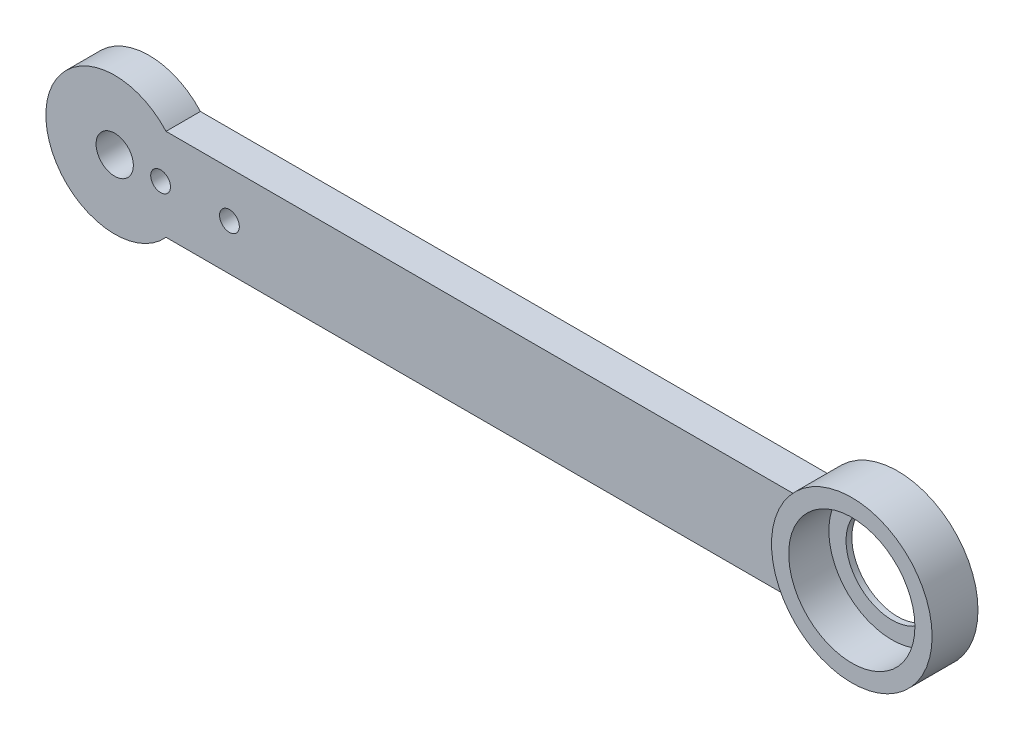
ISO-10303-21;
HEADER;
FILE_DESCRIPTION(('STEP AP214'),'2;1');
FILE_NAME('part.step','',(''),(''),'','','');
FILE_SCHEMA(('AUTOMOTIVE_DESIGN { 1 0 10303 214 1 1 1 1 }'));
ENDSEC;
DATA;
#1=APPLICATION_CONTEXT('core data for automotive mechanical design processes');
#2=APPLICATION_PROTOCOL_DEFINITION('international standard','automotive_design',2000,#1);
#3=PRODUCT_CONTEXT('',#1,'mechanical');
#4=PRODUCT('Part','Part','',(#3));
#5=PRODUCT_RELATED_PRODUCT_CATEGORY('part','',(#4));
#6=PRODUCT_DEFINITION_FORMATION('','',#4);
#7=PRODUCT_DEFINITION_CONTEXT('part definition',#1,'design');
#8=PRODUCT_DEFINITION('design','',#6,#7);
#9=PRODUCT_DEFINITION_SHAPE('','',#8);
#10=(LENGTH_UNIT() NAMED_UNIT(*) SI_UNIT(.MILLI.,.METRE.));
#11=(NAMED_UNIT(*) PLANE_ANGLE_UNIT() SI_UNIT($,.RADIAN.));
#12=(NAMED_UNIT(*) SI_UNIT($,.STERADIAN.) SOLID_ANGLE_UNIT());
#13=UNCERTAINTY_MEASURE_WITH_UNIT(LENGTH_MEASURE(1.E-05),#10,'distance_accuracy_value','');
#14=(GEOMETRIC_REPRESENTATION_CONTEXT(3) GLOBAL_UNCERTAINTY_ASSIGNED_CONTEXT((#13)) GLOBAL_UNIT_ASSIGNED_CONTEXT((#10,
#11,#12)) REPRESENTATION_CONTEXT('',''));
#15=CARTESIAN_POINT('',(0.,0.,0.));
#16=DIRECTION('',(0.,0.,1.));
#17=DIRECTION('',(1.,0.,0.));
#18=AXIS2_PLACEMENT_3D('',#15,#16,#17);
#19=CARTESIAN_POINT('',(0.,0.,9.));
#20=DIRECTION('',(0.,0.,1.));
#21=DIRECTION('',(1.,0.,0.));
#22=AXIS2_PLACEMENT_3D('',#19,#20,#21);
#23=PLANE('',#22);
#24=CARTESIAN_POINT('',(8.,0.,9.));
#25=DIRECTION('',(0.,0.,1.));
#26=DIRECTION('',(1.,0.,0.));
#27=AXIS2_PLACEMENT_3D('',#24,#25,#26);
#28=CIRCLE('',#27,1.725);
#29=CARTESIAN_POINT('',(9.725,0.,9.));
#30=VERTEX_POINT('',#29);
#31=EDGE_CURVE('E114',#30,#30,#28,.F.);
#32=ORIENTED_EDGE('',*,*,#31,.T.);
#33=EDGE_LOOP('',(#32));
#34=FACE_BOUND('',#33,.T.);
#35=CARTESIAN_POINT('',(20.,0.,9.));
#36=DIRECTION('',(0.,0.,1.));
#37=DIRECTION('',(1.,0.,0.));
#38=AXIS2_PLACEMENT_3D('',#35,#36,#37);
#39=CIRCLE('',#38,1.725);
#40=CARTESIAN_POINT('',(21.725,0.,9.));
#41=VERTEX_POINT('',#40);
#42=EDGE_CURVE('E117',#41,#41,#39,.F.);
#43=ORIENTED_EDGE('',*,*,#42,.T.);
#44=EDGE_LOOP('',(#43));
#45=FACE_BOUND('',#44,.T.);
#46=CARTESIAN_POINT('',(0.,0.,9.));
#47=DIRECTION('',(0.,0.,1.));
#48=DIRECTION('',(1.,0.,0.));
#49=AXIS2_PLACEMENT_3D('',#46,#47,#48);
#50=CIRCLE('',#49,3.25);
#51=CARTESIAN_POINT('',(3.25,0.,9.));
#52=VERTEX_POINT('',#51);
#53=EDGE_CURVE('E112',#52,#52,#50,.F.);
#54=ORIENTED_EDGE('',*,*,#53,.T.);
#55=EDGE_LOOP('',(#54));
#56=FACE_BOUND('',#55,.T.);
#57=DIRECTION('',(1.,0.,0.));
#58=VECTOR('',#57,1.);
#59=CARTESIAN_POINT('',(0.,-8.,9.));
#60=LINE('',#59,#58);
#61=CARTESIAN_POINT('',(8.94427190999916,-8.,9.));
#62=VERTEX_POINT('',#61);
#63=CARTESIAN_POINT('',(118.510874706924,-8.,9.));
#64=VERTEX_POINT('',#63);
#65=EDGE_CURVE('E110',#62,#64,#60,.T.);
#66=ORIENTED_EDGE('',*,*,#65,.T.);
#67=CARTESIAN_POINT('',(130.,0.,9.));
#68=DIRECTION('',(0.,0.,1.));
#69=DIRECTION('',(1.,0.,0.));
#70=AXIS2_PLACEMENT_3D('',#67,#68,#69);
#71=CIRCLE('',#70,14.);
#72=CARTESIAN_POINT('',(118.510874706924,8.,9.));
#73=VERTEX_POINT('',#72);
#74=EDGE_CURVE('E95',#64,#73,#71,.F.);
#75=ORIENTED_EDGE('',*,*,#74,.T.);
#76=DIRECTION('',(-1.,0.,0.));
#77=VECTOR('',#76,1.);
#78=CARTESIAN_POINT('',(130.,8.,9.));
#79=LINE('',#78,#77);
#80=CARTESIAN_POINT('',(8.94427190999916,8.,9.));
#81=VERTEX_POINT('',#80);
#82=EDGE_CURVE('E48',#73,#81,#79,.T.);
#83=ORIENTED_EDGE('',*,*,#82,.T.);
#84=CARTESIAN_POINT('',(0.,0.,9.));
#85=DIRECTION('',(0.,0.,1.));
#86=DIRECTION('',(1.,0.,0.));
#87=AXIS2_PLACEMENT_3D('',#84,#85,#86);
#88=CIRCLE('',#87,12.);
#89=EDGE_CURVE('E98',#81,#62,#88,.T.);
#90=ORIENTED_EDGE('',*,*,#89,.T.);
#91=EDGE_LOOP('',(#66,#75,#83,#90));
#92=FACE_BOUND('',#91,.T.);
#93=ADVANCED_FACE('F39',(#34,#45,#56,#92),#23,.T.);
#94=CARTESIAN_POINT('',(0.,0.,3.));
#95=DIRECTION('',(0.,0.,1.));
#96=DIRECTION('',(1.,0.,0.));
#97=AXIS2_PLACEMENT_3D('',#94,#95,#96);
#98=PLANE('',#97);
#99=CARTESIAN_POINT('',(20.,0.,3.));
#100=DIRECTION('',(0.,0.,1.));
#101=DIRECTION('',(1.,0.,0.));
#102=AXIS2_PLACEMENT_3D('',#99,#100,#101);
#103=CIRCLE('',#102,2.9);
#104=CARTESIAN_POINT('',(22.9,0.,3.));
#105=VERTEX_POINT('',#104);
#106=EDGE_CURVE('E130',#105,#105,#103,.T.);
#107=ORIENTED_EDGE('',*,*,#106,.T.);
#108=EDGE_LOOP('',(#107));
#109=FACE_BOUND('',#108,.T.);
#110=CARTESIAN_POINT('',(8.,0.,3.));
#111=DIRECTION('',(0.,0.,1.));
#112=DIRECTION('',(1.,0.,0.));
#113=AXIS2_PLACEMENT_3D('',#110,#111,#112);
#114=CIRCLE('',#113,2.9);
#115=CARTESIAN_POINT('',(10.9,0.,3.));
#116=VERTEX_POINT('',#115);
#117=EDGE_CURVE('E125',#116,#116,#114,.T.);
#118=ORIENTED_EDGE('',*,*,#117,.T.);
#119=EDGE_LOOP('',(#118));
#120=FACE_BOUND('',#119,.T.);
#121=CARTESIAN_POINT('',(0.,0.,3.));
#122=DIRECTION('',(0.,0.,1.));
#123=DIRECTION('',(1.,0.,0.));
#124=AXIS2_PLACEMENT_3D('',#121,#122,#123);
#125=CIRCLE('',#124,3.25);
#126=CARTESIAN_POINT('',(3.25,0.,3.));
#127=VERTEX_POINT('',#126);
#128=EDGE_CURVE('E111',#127,#127,#125,.F.);
#129=ORIENTED_EDGE('',*,*,#128,.F.);
#130=EDGE_LOOP('',(#129));
#131=FACE_BOUND('',#130,.T.);
#132=CARTESIAN_POINT('',(130.,0.,3.));
#133=DIRECTION('',(0.,0.,1.));
#134=DIRECTION('',(1.,0.,0.));
#135=AXIS2_PLACEMENT_3D('',#132,#133,#134);
#136=CIRCLE('',#135,14.);
#137=CARTESIAN_POINT('',(118.510874706924,-8.00000000000001,3.));
#138=VERTEX_POINT('',#137);
#139=CARTESIAN_POINT('',(118.510874706924,8.,3.));
#140=VERTEX_POINT('',#139);
#141=EDGE_CURVE('E11',#138,#140,#136,.F.);
#142=ORIENTED_EDGE('',*,*,#141,.F.);
#143=DIRECTION('',(1.,0.,0.));
#144=VECTOR('',#143,1.);
#145=CARTESIAN_POINT('',(0.,-8.,3.));
#146=LINE('',#145,#144);
#147=CARTESIAN_POINT('',(8.94427190999916,-8.,3.));
#148=VERTEX_POINT('',#147);
#149=EDGE_CURVE('E84',#148,#138,#146,.T.);
#150=ORIENTED_EDGE('',*,*,#149,.F.);
#151=CARTESIAN_POINT('',(0.,0.,3.));
#152=DIRECTION('',(0.,0.,1.));
#153=DIRECTION('',(1.,0.,0.));
#154=AXIS2_PLACEMENT_3D('',#151,#152,#153);
#155=CIRCLE('',#154,12.);
#156=CARTESIAN_POINT('',(8.94427190999916,8.,3.));
#157=VERTEX_POINT('',#156);
#158=EDGE_CURVE('E92',#157,#148,#155,.T.);
#159=ORIENTED_EDGE('',*,*,#158,.F.);
#160=DIRECTION('',(-1.,0.,0.));
#161=VECTOR('',#160,1.);
#162=CARTESIAN_POINT('',(130.,8.,3.));
#163=LINE('',#162,#161);
#164=EDGE_CURVE('E85',#140,#157,#163,.T.);
#165=ORIENTED_EDGE('',*,*,#164,.F.);
#166=EDGE_LOOP('',(#142,#150,#159,#165));
#167=FACE_BOUND('',#166,.T.);
#168=ADVANCED_FACE('F78',(#109,#120,#131,#167),#98,.F.);
#169=CARTESIAN_POINT('',(0.,-8.,9.));
#170=DIRECTION('',(0.,1.,0.));
#171=DIRECTION('',(0.,0.,1.));
#172=AXIS2_PLACEMENT_3D('',#169,#170,#171);
#173=PLANE('',#172);
#174=DIRECTION('',(0.,0.,-1.));
#175=VECTOR('',#174,1.);
#176=CARTESIAN_POINT('',(118.510874706924,-8.,9.));
#177=LINE('',#176,#175);
#178=EDGE_CURVE('E57',#64,#138,#177,.T.);
#179=ORIENTED_EDGE('',*,*,#178,.F.);
#180=ORIENTED_EDGE('',*,*,#65,.F.);
#181=DIRECTION('',(0.,0.,-1.));
#182=VECTOR('',#181,1.);
#183=CARTESIAN_POINT('',(8.94427190999916,-8.,9.));
#184=LINE('',#183,#182);
#185=EDGE_CURVE('E86',#148,#62,#184,.F.);
#186=ORIENTED_EDGE('',*,*,#185,.F.);
#187=ORIENTED_EDGE('',*,*,#149,.T.);
#188=EDGE_LOOP('',(#179,#180,#186,#187));
#189=FACE_BOUND('',#188,.T.);
#190=ADVANCED_FACE('F41',(#189),#173,.F.);
#191=CARTESIAN_POINT('',(130.,8.,9.));
#192=DIRECTION('',(0.,-1.,0.));
#193=DIRECTION('',(0.,0.,-1.));
#194=AXIS2_PLACEMENT_3D('',#191,#192,#193);
#195=PLANE('',#194);
#196=DIRECTION('',(0.,0.,-1.));
#197=VECTOR('',#196,1.);
#198=CARTESIAN_POINT('',(118.510874706924,8.,9.));
#199=LINE('',#198,#197);
#200=EDGE_CURVE('E93',#140,#73,#199,.F.);
#201=ORIENTED_EDGE('',*,*,#200,.F.);
#202=ORIENTED_EDGE('',*,*,#164,.T.);
#203=DIRECTION('',(0.,0.,-1.));
#204=VECTOR('',#203,1.);
#205=CARTESIAN_POINT('',(8.94427190999916,8.,9.));
#206=LINE('',#205,#204);
#207=EDGE_CURVE('E105',#81,#157,#206,.T.);
#208=ORIENTED_EDGE('',*,*,#207,.F.);
#209=ORIENTED_EDGE('',*,*,#82,.F.);
#210=EDGE_LOOP('',(#201,#202,#208,#209));
#211=FACE_BOUND('',#210,.T.);
#212=ADVANCED_FACE('F159',(#211),#195,.F.);
#213=CARTESIAN_POINT('',(0.,0.,9.));
#214=DIRECTION('',(0.,0.,-1.));
#215=DIRECTION('',(-1.,0.,0.));
#216=AXIS2_PLACEMENT_3D('',#213,#214,#215);
#217=CYLINDRICAL_SURFACE('',#216,12.);
#218=ORIENTED_EDGE('',*,*,#158,.T.);
#219=ORIENTED_EDGE('',*,*,#185,.T.);
#220=ORIENTED_EDGE('',*,*,#89,.F.);
#221=ORIENTED_EDGE('',*,*,#207,.T.);
#222=EDGE_LOOP('',(#218,#219,#220,#221));
#223=FACE_BOUND('',#222,.T.);
#224=ADVANCED_FACE('F157',(#223),#217,.T.);
#225=CARTESIAN_POINT('',(130.,0.,9.));
#226=DIRECTION('',(0.,0.,-1.));
#227=DIRECTION('',(-1.,0.,0.));
#228=AXIS2_PLACEMENT_3D('',#225,#226,#227);
#229=CYLINDRICAL_SURFACE('',#228,14.);
#230=ORIENTED_EDGE('',*,*,#200,.T.);
#231=ORIENTED_EDGE('',*,*,#74,.F.);
#232=ORIENTED_EDGE('',*,*,#178,.T.);
#233=ORIENTED_EDGE('',*,*,#141,.T.);
#234=EDGE_LOOP('',(#230,#231,#232,#233));
#235=FACE_BOUND('',#234,.T.);
#236=CARTESIAN_POINT('',(130.,0.,2.5));
#237=DIRECTION('',(0.,0.,1.));
#238=DIRECTION('',(1.,0.,0.));
#239=AXIS2_PLACEMENT_3D('',#236,#237,#238);
#240=CIRCLE('',#239,14.);
#241=CARTESIAN_POINT('',(144.,0.,2.5));
#242=VERTEX_POINT('',#241);
#243=EDGE_CURVE('E147',#242,#242,#240,.T.);
#244=ORIENTED_EDGE('',*,*,#243,.T.);
#245=EDGE_LOOP('',(#244));
#246=FACE_BOUND('',#245,.T.);
#247=CARTESIAN_POINT('',(130.,0.,10.5));
#248=DIRECTION('',(0.,0.,1.));
#249=DIRECTION('',(1.,0.,0.));
#250=AXIS2_PLACEMENT_3D('',#247,#248,#249);
#251=CIRCLE('',#250,14.);
#252=CARTESIAN_POINT('',(144.,0.,10.5));
#253=VERTEX_POINT('',#252);
#254=EDGE_CURVE('E150',#253,#253,#251,.T.);
#255=ORIENTED_EDGE('',*,*,#254,.F.);
#256=EDGE_LOOP('',(#255));
#257=FACE_BOUND('',#256,.T.);
#258=ADVANCED_FACE('F88',(#235,#246,#257),#229,.T.);
#259=CARTESIAN_POINT('',(130.,0.,2.5));
#260=DIRECTION('',(0.,0.,1.));
#261=DIRECTION('',(1.,0.,0.));
#262=AXIS2_PLACEMENT_3D('',#259,#260,#261);
#263=PLANE('',#262);
#264=CARTESIAN_POINT('',(130.,0.,2.5));
#265=DIRECTION('',(0.,0.,1.));
#266=DIRECTION('',(1.,0.,0.));
#267=AXIS2_PLACEMENT_3D('',#264,#265,#266);
#268=CIRCLE('',#267,8.00000000000001);
#269=CARTESIAN_POINT('',(138.,0.,2.5));
#270=VERTEX_POINT('',#269);
#271=EDGE_CURVE('E233',#270,#270,#268,.F.);
#272=ORIENTED_EDGE('',*,*,#271,.F.);
#273=EDGE_LOOP('',(#272));
#274=FACE_BOUND('',#273,.T.);
#275=ORIENTED_EDGE('',*,*,#243,.F.);
#276=EDGE_LOOP('',(#275));
#277=FACE_BOUND('',#276,.T.);
#278=ADVANCED_FACE('F181',(#274,#277),#263,.F.);
#279=CARTESIAN_POINT('',(130.,0.,10.5));
#280=DIRECTION('',(0.,0.,1.));
#281=DIRECTION('',(1.,0.,0.));
#282=AXIS2_PLACEMENT_3D('',#279,#280,#281);
#283=PLANE('',#282);
#284=CARTESIAN_POINT('',(130.,0.,10.5));
#285=DIRECTION('',(0.,0.,1.));
#286=DIRECTION('',(1.,0.,0.));
#287=AXIS2_PLACEMENT_3D('',#284,#285,#286);
#288=CIRCLE('',#287,11.);
#289=CARTESIAN_POINT('',(141.,0.,10.5));
#290=VERTEX_POINT('',#289);
#291=EDGE_CURVE('E133',#290,#290,#288,.T.);
#292=ORIENTED_EDGE('',*,*,#291,.F.);
#293=EDGE_LOOP('',(#292));
#294=FACE_BOUND('',#293,.T.);
#295=ORIENTED_EDGE('',*,*,#254,.T.);
#296=EDGE_LOOP('',(#295));
#297=FACE_BOUND('',#296,.T.);
#298=ADVANCED_FACE('F183',(#294,#297),#283,.T.);
#299=CARTESIAN_POINT('',(0.,0.,2.5));
#300=DIRECTION('',(0.,0.,-1.));
#301=DIRECTION('',(-1.,0.,0.));
#302=AXIS2_PLACEMENT_3D('',#299,#300,#301);
#303=CYLINDRICAL_SURFACE('',#302,3.25);
#304=ORIENTED_EDGE('',*,*,#53,.F.);
#305=EDGE_LOOP('',(#304));
#306=FACE_BOUND('',#305,.T.);
#307=ORIENTED_EDGE('',*,*,#128,.T.);
#308=EDGE_LOOP('',(#307));
#309=FACE_BOUND('',#308,.T.);
#310=ADVANCED_FACE('F189',(#306,#309),#303,.F.);
#311=CARTESIAN_POINT('',(20.,0.,2.5));
#312=DIRECTION('',(0.,0.,-1.));
#313=DIRECTION('',(-1.,0.,0.));
#314=AXIS2_PLACEMENT_3D('',#311,#312,#313);
#315=CYLINDRICAL_SURFACE('',#314,1.725);
#316=CARTESIAN_POINT('',(20.,0.,5.2));
#317=DIRECTION('',(0.,0.,1.));
#318=DIRECTION('',(1.,0.,0.));
#319=AXIS2_PLACEMENT_3D('',#316,#317,#318);
#320=CIRCLE('',#319,1.725);
#321=CARTESIAN_POINT('',(21.725,0.,5.2));
#322=VERTEX_POINT('',#321);
#323=EDGE_CURVE('E119',#322,#322,#320,.T.);
#324=ORIENTED_EDGE('',*,*,#323,.F.);
#325=EDGE_LOOP('',(#324));
#326=FACE_BOUND('',#325,.T.);
#327=ORIENTED_EDGE('',*,*,#42,.F.);
#328=EDGE_LOOP('',(#327));
#329=FACE_BOUND('',#328,.T.);
#330=ADVANCED_FACE('F193',(#326,#329),#315,.F.);
#331=CARTESIAN_POINT('',(8.,0.,2.5));
#332=DIRECTION('',(0.,0.,-1.));
#333=DIRECTION('',(-1.,0.,0.));
#334=AXIS2_PLACEMENT_3D('',#331,#332,#333);
#335=CYLINDRICAL_SURFACE('',#334,1.725);
#336=CARTESIAN_POINT('',(8.,0.,5.2));
#337=DIRECTION('',(0.,0.,1.));
#338=DIRECTION('',(1.,0.,0.));
#339=AXIS2_PLACEMENT_3D('',#336,#337,#338);
#340=CIRCLE('',#339,1.725);
#341=CARTESIAN_POINT('',(9.725,0.,5.2));
#342=VERTEX_POINT('',#341);
#343=EDGE_CURVE('E116',#342,#342,#340,.T.);
#344=ORIENTED_EDGE('',*,*,#343,.F.);
#345=EDGE_LOOP('',(#344));
#346=FACE_BOUND('',#345,.T.);
#347=ORIENTED_EDGE('',*,*,#31,.F.);
#348=EDGE_LOOP('',(#347));
#349=FACE_BOUND('',#348,.T.);
#350=ADVANCED_FACE('F191',(#346,#349),#335,.F.);
#351=CARTESIAN_POINT('',(8.,0.,5.2));
#352=DIRECTION('',(0.,0.,-1.));
#353=DIRECTION('',(-1.,0.,0.));
#354=AXIS2_PLACEMENT_3D('',#351,#352,#353);
#355=CYLINDRICAL_SURFACE('',#354,2.9);
#356=CARTESIAN_POINT('',(8.,0.,5.2));
#357=DIRECTION('',(0.,0.,1.));
#358=DIRECTION('',(1.,0.,0.));
#359=AXIS2_PLACEMENT_3D('',#356,#357,#358);
#360=CIRCLE('',#359,2.9);
#361=CARTESIAN_POINT('',(10.9,0.,5.2));
#362=VERTEX_POINT('',#361);
#363=EDGE_CURVE('E118',#362,#362,#360,.T.);
#364=ORIENTED_EDGE('',*,*,#363,.T.);
#365=EDGE_LOOP('',(#364));
#366=FACE_BOUND('',#365,.T.);
#367=ORIENTED_EDGE('',*,*,#117,.F.);
#368=EDGE_LOOP('',(#367));
#369=FACE_BOUND('',#368,.T.);
#370=ADVANCED_FACE('F199',(#366,#369),#355,.F.);
#371=CARTESIAN_POINT('',(8.,0.,5.2));
#372=DIRECTION('',(0.,0.,1.));
#373=DIRECTION('',(1.,0.,0.));
#374=AXIS2_PLACEMENT_3D('',#371,#372,#373);
#375=PLANE('',#374);
#376=ORIENTED_EDGE('',*,*,#343,.T.);
#377=EDGE_LOOP('',(#376));
#378=FACE_BOUND('',#377,.T.);
#379=ORIENTED_EDGE('',*,*,#363,.F.);
#380=EDGE_LOOP('',(#379));
#381=FACE_BOUND('',#380,.T.);
#382=ADVANCED_FACE('F205',(#378,#381),#375,.F.);
#383=CARTESIAN_POINT('',(20.,0.,5.2));
#384=DIRECTION('',(0.,0.,-1.));
#385=DIRECTION('',(-1.,0.,0.));
#386=AXIS2_PLACEMENT_3D('',#383,#384,#385);
#387=CYLINDRICAL_SURFACE('',#386,2.9);
#388=CARTESIAN_POINT('',(20.,0.,5.2));
#389=DIRECTION('',(0.,0.,1.));
#390=DIRECTION('',(1.,0.,0.));
#391=AXIS2_PLACEMENT_3D('',#388,#389,#390);
#392=CIRCLE('',#391,2.9);
#393=CARTESIAN_POINT('',(22.9,0.,5.2));
#394=VERTEX_POINT('',#393);
#395=EDGE_CURVE('E124',#394,#394,#392,.T.);
#396=ORIENTED_EDGE('',*,*,#395,.T.);
#397=EDGE_LOOP('',(#396));
#398=FACE_BOUND('',#397,.T.);
#399=ORIENTED_EDGE('',*,*,#106,.F.);
#400=EDGE_LOOP('',(#399));
#401=FACE_BOUND('',#400,.T.);
#402=ADVANCED_FACE('F207',(#398,#401),#387,.F.);
#403=CARTESIAN_POINT('',(20.,0.,5.2));
#404=DIRECTION('',(0.,0.,1.));
#405=DIRECTION('',(1.,0.,0.));
#406=AXIS2_PLACEMENT_3D('',#403,#404,#405);
#407=PLANE('',#406);
#408=ORIENTED_EDGE('',*,*,#323,.T.);
#409=EDGE_LOOP('',(#408));
#410=FACE_BOUND('',#409,.T.);
#411=ORIENTED_EDGE('',*,*,#395,.F.);
#412=EDGE_LOOP('',(#411));
#413=FACE_BOUND('',#412,.T.);
#414=ADVANCED_FACE('F208',(#410,#413),#407,.F.);
#415=CARTESIAN_POINT('',(130.,0.,10.5));
#416=DIRECTION('',(0.,0.,-1.));
#417=DIRECTION('',(-1.,0.,0.));
#418=AXIS2_PLACEMENT_3D('',#415,#416,#417);
#419=CYLINDRICAL_SURFACE('',#418,11.);
#420=ORIENTED_EDGE('',*,*,#291,.T.);
#421=EDGE_LOOP('',(#420));
#422=FACE_BOUND('',#421,.T.);
#423=CARTESIAN_POINT('',(130.,0.,3.5));
#424=DIRECTION('',(0.,0.,1.));
#425=DIRECTION('',(1.,0.,0.));
#426=AXIS2_PLACEMENT_3D('',#423,#424,#425);
#427=CIRCLE('',#426,11.);
#428=CARTESIAN_POINT('',(141.,0.,3.5));
#429=VERTEX_POINT('',#428);
#430=EDGE_CURVE('E140',#429,#429,#427,.T.);
#431=ORIENTED_EDGE('',*,*,#430,.F.);
#432=EDGE_LOOP('',(#431));
#433=FACE_BOUND('',#432,.T.);
#434=ADVANCED_FACE('F212',(#422,#433),#419,.F.);
#435=CARTESIAN_POINT('',(130.,0.,3.5));
#436=DIRECTION('',(0.,0.,1.));
#437=DIRECTION('',(1.,0.,0.));
#438=AXIS2_PLACEMENT_3D('',#435,#436,#437);
#439=PLANE('',#438);
#440=CARTESIAN_POINT('',(130.,0.,3.5));
#441=DIRECTION('',(0.,0.,1.));
#442=DIRECTION('',(1.,0.,0.));
#443=AXIS2_PLACEMENT_3D('',#440,#441,#442);
#444=CIRCLE('',#443,8.00000000000001);
#445=CARTESIAN_POINT('',(138.,0.,3.5));
#446=VERTEX_POINT('',#445);
#447=EDGE_CURVE('E43',#446,#446,#444,.F.);
#448=ORIENTED_EDGE('',*,*,#447,.T.);
#449=EDGE_LOOP('',(#448));
#450=FACE_BOUND('',#449,.T.);
#451=ORIENTED_EDGE('',*,*,#430,.T.);
#452=EDGE_LOOP('',(#451));
#453=FACE_BOUND('',#452,.T.);
#454=ADVANCED_FACE('F216',(#450,#453),#439,.T.);
#455=CARTESIAN_POINT('',(130.,0.,2.5));
#456=DIRECTION('',(0.,0.,-1.));
#457=DIRECTION('',(-1.,0.,0.));
#458=AXIS2_PLACEMENT_3D('',#455,#456,#457);
#459=CYLINDRICAL_SURFACE('',#458,8.00000000000001);
#460=ORIENTED_EDGE('',*,*,#447,.F.);
#461=EDGE_LOOP('',(#460));
#462=FACE_BOUND('',#461,.T.);
#463=ORIENTED_EDGE('',*,*,#271,.T.);
#464=EDGE_LOOP('',(#463));
#465=FACE_BOUND('',#464,.T.);
#466=ADVANCED_FACE('F220',(#462,#465),#459,.F.);
#467=CLOSED_SHELL('',(#93,#168,#190,#212,#224,#258,#278,#298,#310,#330,#350,#370,#382,#402,#414,
#434,#454,#466));
#468=MANIFOLD_SOLID_BREP('B2',#467);
#469=ADVANCED_BREP_SHAPE_REPRESENTATION('',(#18,#468),#14);
#470=SHAPE_DEFINITION_REPRESENTATION(#9,#469);
ENDSEC;
END-ISO-10303-21;
